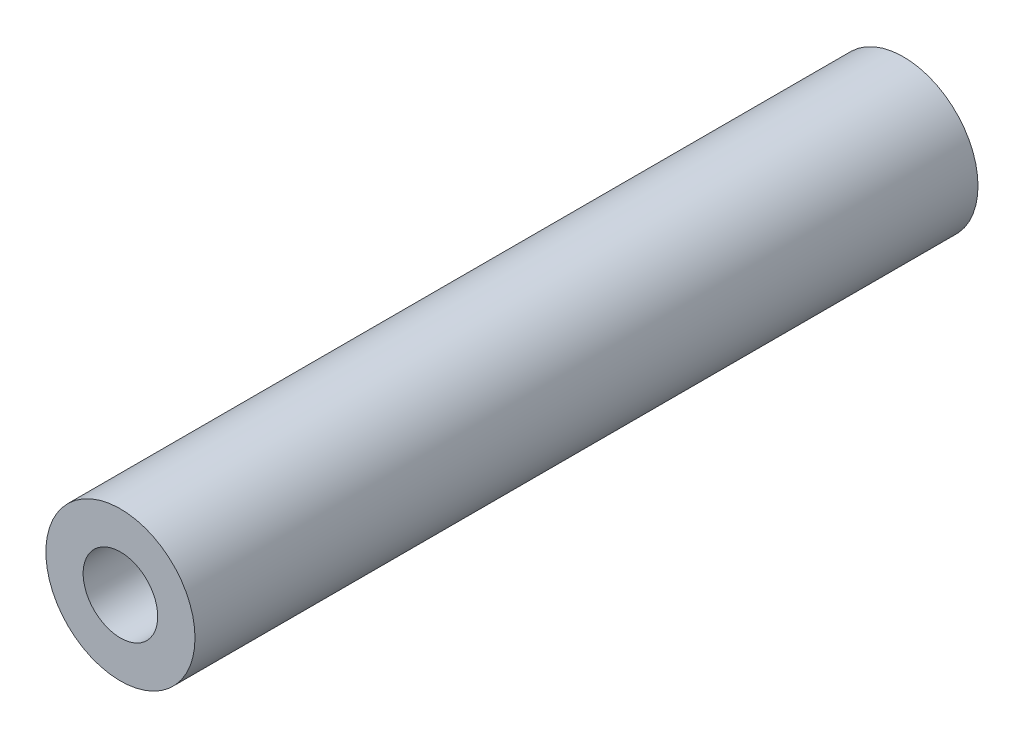
ISO-10303-21;
HEADER;
FILE_DESCRIPTION(('STEP AP214'),'2;1');
FILE_NAME('part.step','',(''),(''),'','','');
FILE_SCHEMA(('AUTOMOTIVE_DESIGN { 1 0 10303 214 1 1 1 1 }'));
ENDSEC;
DATA;
#1=APPLICATION_CONTEXT('core data for automotive mechanical design processes');
#2=APPLICATION_PROTOCOL_DEFINITION('international standard','automotive_design',2000,#1);
#3=PRODUCT_CONTEXT('',#1,'mechanical');
#4=PRODUCT('Part','Part','',(#3));
#5=PRODUCT_RELATED_PRODUCT_CATEGORY('part','',(#4));
#6=PRODUCT_DEFINITION_FORMATION('','',#4);
#7=PRODUCT_DEFINITION_CONTEXT('part definition',#1,'design');
#8=PRODUCT_DEFINITION('design','',#6,#7);
#9=PRODUCT_DEFINITION_SHAPE('','',#8);
#10=(LENGTH_UNIT() NAMED_UNIT(*) SI_UNIT(.MILLI.,.METRE.));
#11=(NAMED_UNIT(*) PLANE_ANGLE_UNIT() SI_UNIT($,.RADIAN.));
#12=(NAMED_UNIT(*) SI_UNIT($,.STERADIAN.) SOLID_ANGLE_UNIT());
#13=UNCERTAINTY_MEASURE_WITH_UNIT(LENGTH_MEASURE(1.E-05),#10,'distance_accuracy_value','');
#14=(GEOMETRIC_REPRESENTATION_CONTEXT(3) GLOBAL_UNCERTAINTY_ASSIGNED_CONTEXT((#13)) GLOBAL_UNIT_ASSIGNED_CONTEXT((#10,
#11,#12)) REPRESENTATION_CONTEXT('',''));
#15=CARTESIAN_POINT('',(0.,0.,0.));
#16=DIRECTION('',(0.,0.,1.));
#17=DIRECTION('',(1.,0.,0.));
#18=AXIS2_PLACEMENT_3D('',#15,#16,#17);
#19=CARTESIAN_POINT('',(0.,0.,66.675));
#20=DIRECTION('',(0.,0.,1.));
#21=DIRECTION('',(1.,0.,0.));
#22=AXIS2_PLACEMENT_3D('',#19,#20,#21);
#23=PLANE('',#22);
#24=CARTESIAN_POINT('',(0.,0.,66.675));
#25=DIRECTION('',(0.,0.,1.));
#26=DIRECTION('',(1.,0.,0.));
#27=AXIS2_PLACEMENT_3D('',#24,#25,#26);
#28=CIRCLE('',#27,6.35);
#29=CARTESIAN_POINT('',(6.35,0.,66.675));
#30=VERTEX_POINT('',#29);
#31=EDGE_CURVE('E10',#30,#30,#28,.T.);
#32=ORIENTED_EDGE('',*,*,#31,.T.);
#33=EDGE_LOOP('',(#32));
#34=FACE_BOUND('',#33,.T.);
#35=CARTESIAN_POINT('',(0.,0.,66.675));
#36=DIRECTION('',(0.,0.,1.));
#37=DIRECTION('',(1.,0.,0.));
#38=AXIS2_PLACEMENT_3D('',#35,#36,#37);
#39=CIRCLE('',#38,3.175);
#40=CARTESIAN_POINT('',(3.175,0.,66.675));
#41=VERTEX_POINT('',#40);
#42=EDGE_CURVE('E42',#41,#41,#39,.T.);
#43=ORIENTED_EDGE('',*,*,#42,.F.);
#44=EDGE_LOOP('',(#43));
#45=FACE_BOUND('',#44,.T.);
#46=ADVANCED_FACE('F31',(#34,#45),#23,.T.);
#47=CARTESIAN_POINT('',(0.,0.,0.));
#48=DIRECTION('',(0.,0.,1.));
#49=DIRECTION('',(1.,0.,0.));
#50=AXIS2_PLACEMENT_3D('',#47,#48,#49);
#51=PLANE('',#50);
#52=CARTESIAN_POINT('',(0.,0.,0.));
#53=DIRECTION('',(0.,0.,1.));
#54=DIRECTION('',(1.,0.,0.));
#55=AXIS2_PLACEMENT_3D('',#52,#53,#54);
#56=CIRCLE('',#55,6.35);
#57=CARTESIAN_POINT('',(6.35,0.,0.));
#58=VERTEX_POINT('',#57);
#59=EDGE_CURVE('E35',#58,#58,#56,.T.);
#60=ORIENTED_EDGE('',*,*,#59,.F.);
#61=EDGE_LOOP('',(#60));
#62=FACE_BOUND('',#61,.T.);
#63=CARTESIAN_POINT('',(0.,0.,0.));
#64=DIRECTION('',(0.,0.,1.));
#65=DIRECTION('',(1.,0.,0.));
#66=AXIS2_PLACEMENT_3D('',#63,#64,#65);
#67=CIRCLE('',#66,3.175);
#68=CARTESIAN_POINT('',(3.175,0.,0.));
#69=VERTEX_POINT('',#68);
#70=EDGE_CURVE('E44',#69,#69,#67,.T.);
#71=ORIENTED_EDGE('',*,*,#70,.T.);
#72=EDGE_LOOP('',(#71));
#73=FACE_BOUND('',#72,.T.);
#74=ADVANCED_FACE('F54',(#62,#73),#51,.F.);
#75=CARTESIAN_POINT('',(0.,0.,66.675));
#76=DIRECTION('',(0.,0.,-1.));
#77=DIRECTION('',(-1.,0.,0.));
#78=AXIS2_PLACEMENT_3D('',#75,#76,#77);
#79=CYLINDRICAL_SURFACE('',#78,6.35);
#80=ORIENTED_EDGE('',*,*,#31,.F.);
#81=EDGE_LOOP('',(#80));
#82=FACE_BOUND('',#81,.T.);
#83=ORIENTED_EDGE('',*,*,#59,.T.);
#84=EDGE_LOOP('',(#83));
#85=FACE_BOUND('',#84,.T.);
#86=ADVANCED_FACE('F33',(#82,#85),#79,.T.);
#87=CARTESIAN_POINT('',(0.,0.,66.675));
#88=DIRECTION('',(0.,0.,-1.));
#89=DIRECTION('',(-1.,0.,0.));
#90=AXIS2_PLACEMENT_3D('',#87,#88,#89);
#91=CYLINDRICAL_SURFACE('',#90,3.175);
#92=ORIENTED_EDGE('',*,*,#42,.T.);
#93=EDGE_LOOP('',(#92));
#94=FACE_BOUND('',#93,.T.);
#95=ORIENTED_EDGE('',*,*,#70,.F.);
#96=EDGE_LOOP('',(#95));
#97=FACE_BOUND('',#96,.T.);
#98=ADVANCED_FACE('F50',(#94,#97),#91,.F.);
#99=CLOSED_SHELL('',(#46,#74,#86,#98));
#100=MANIFOLD_SOLID_BREP('B2',#99);
#101=ADVANCED_BREP_SHAPE_REPRESENTATION('',(#18,#100),#14);
#102=SHAPE_DEFINITION_REPRESENTATION(#9,#101);
ENDSEC;
END-ISO-10303-21;
